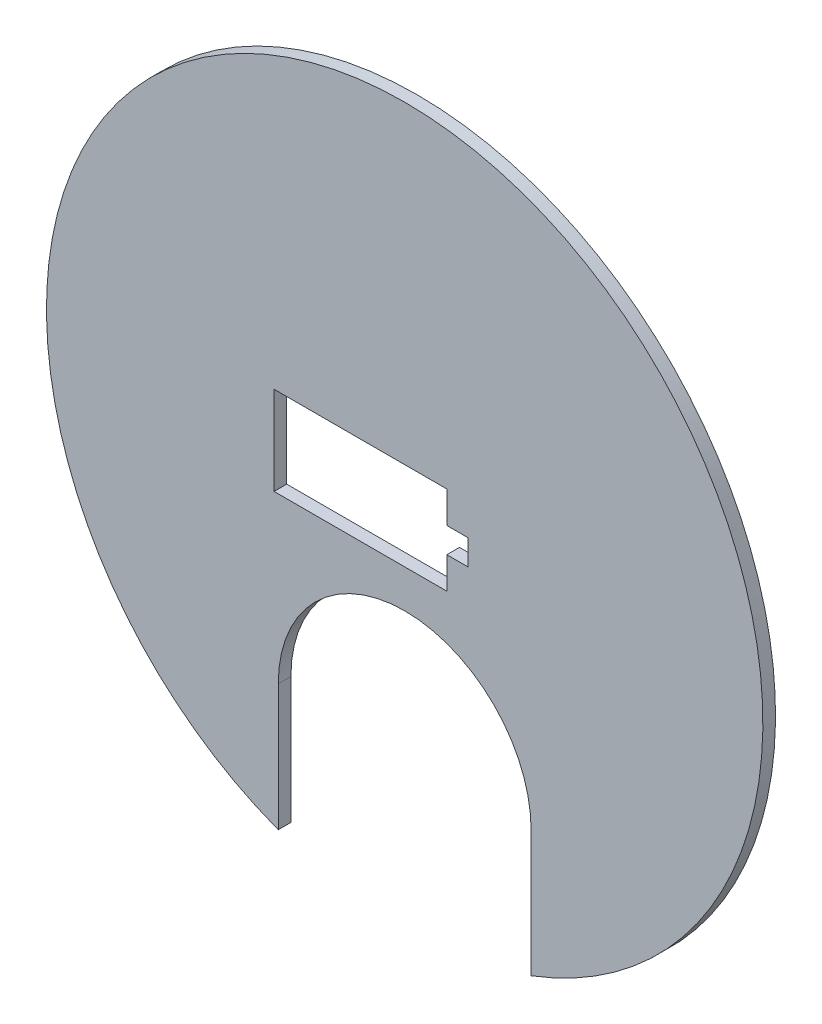
ISO-10303-21;
HEADER;
FILE_DESCRIPTION(('STEP AP214'),'2;1');
FILE_NAME('part.step','',(''),(''),'','','');
FILE_SCHEMA(('AUTOMOTIVE_DESIGN { 1 0 10303 214 1 1 1 1 }'));
ENDSEC;
DATA;
#1=APPLICATION_CONTEXT('core data for automotive mechanical design processes');
#2=APPLICATION_PROTOCOL_DEFINITION('international standard','automotive_design',2000,#1);
#3=PRODUCT_CONTEXT('',#1,'mechanical');
#4=PRODUCT('Part','Part','',(#3));
#5=PRODUCT_RELATED_PRODUCT_CATEGORY('part','',(#4));
#6=PRODUCT_DEFINITION_FORMATION('','',#4);
#7=PRODUCT_DEFINITION_CONTEXT('part definition',#1,'design');
#8=PRODUCT_DEFINITION('design','',#6,#7);
#9=PRODUCT_DEFINITION_SHAPE('','',#8);
#10=(LENGTH_UNIT() NAMED_UNIT(*) SI_UNIT(.MILLI.,.METRE.));
#11=(NAMED_UNIT(*) PLANE_ANGLE_UNIT() SI_UNIT($,.RADIAN.));
#12=(NAMED_UNIT(*) SI_UNIT($,.STERADIAN.) SOLID_ANGLE_UNIT());
#13=UNCERTAINTY_MEASURE_WITH_UNIT(LENGTH_MEASURE(1.E-05),#10,'distance_accuracy_value','');
#14=(GEOMETRIC_REPRESENTATION_CONTEXT(3) GLOBAL_UNCERTAINTY_ASSIGNED_CONTEXT((#13)) GLOBAL_UNIT_ASSIGNED_CONTEXT((#10,
#11,#12)) REPRESENTATION_CONTEXT('',''));
#15=CARTESIAN_POINT('',(0.,0.,0.));
#16=DIRECTION('',(0.,0.,1.));
#17=DIRECTION('',(1.,0.,0.));
#18=AXIS2_PLACEMENT_3D('',#15,#16,#17);
#19=CARTESIAN_POINT('',(-11.1979245368425,8.24446622018527,3.));
#20=DIRECTION('',(0.,0.,-1.));
#21=DIRECTION('',(-1.,0.,0.));
#22=AXIS2_PLACEMENT_3D('',#19,#20,#21);
#23=CYLINDRICAL_SURFACE('',#22,85.);
#24=CARTESIAN_POINT('',(-11.1979245368425,8.24446622018527,3.));
#25=DIRECTION('',(0.,0.,1.));
#26=DIRECTION('',(1.,0.,0.));
#27=AXIS2_PLACEMENT_3D('',#24,#25,#26);
#28=CIRCLE('',#27,85.);
#29=CARTESIAN_POINT('',(18.8020754631574,-71.2854023827491,3.));
#30=VERTEX_POINT('',#29);
#31=CARTESIAN_POINT('',(-41.1979245368426,-71.285402382749,3.));
#32=VERTEX_POINT('',#31);
#33=EDGE_CURVE('E11',#30,#32,#28,.T.);
#34=ORIENTED_EDGE('',*,*,#33,.F.);
#35=DIRECTION('',(0.,0.,-1.));
#36=VECTOR('',#35,1.);
#37=CARTESIAN_POINT('',(18.8020754631574,-71.2854023827491,3.));
#38=LINE('',#37,#36);
#39=CARTESIAN_POINT('',(18.8020754631574,-71.2854023827491,0.));
#40=VERTEX_POINT('',#39);
#41=EDGE_CURVE('E150',#30,#40,#38,.T.);
#42=ORIENTED_EDGE('',*,*,#41,.T.);
#43=CARTESIAN_POINT('',(-11.1979245368425,8.24446622018527,0.));
#44=DIRECTION('',(0.,0.,1.));
#45=DIRECTION('',(1.,0.,0.));
#46=AXIS2_PLACEMENT_3D('',#43,#44,#45);
#47=CIRCLE('',#46,85.);
#48=CARTESIAN_POINT('',(-41.1979245368426,-71.285402382749,0.));
#49=VERTEX_POINT('',#48);
#50=EDGE_CURVE('E36',#40,#49,#47,.T.);
#51=ORIENTED_EDGE('',*,*,#50,.T.);
#52=DIRECTION('',(0.,0.,-1.));
#53=VECTOR('',#52,1.);
#54=CARTESIAN_POINT('',(-41.1979245368426,-71.285402382749,3.));
#55=LINE('',#54,#53);
#56=EDGE_CURVE('E47',#32,#49,#55,.T.);
#57=ORIENTED_EDGE('',*,*,#56,.F.);
#58=EDGE_LOOP('',(#34,#42,#51,#57));
#59=FACE_BOUND('',#58,.T.);
#60=ADVANCED_FACE('F33',(#59),#23,.T.);
#61=CARTESIAN_POINT('',(-11.1979245368425,8.24446622018527,3.));
#62=DIRECTION('',(0.,0.,1.));
#63=DIRECTION('',(1.,0.,0.));
#64=AXIS2_PLACEMENT_3D('',#61,#62,#63);
#65=PLANE('',#64);
#66=DIRECTION('',(0.,-1.,0.));
#67=VECTOR('',#66,1.);
#68=CARTESIAN_POINT('',(18.8020754631574,-71.2854023827491,3.));
#69=LINE('',#68,#67);
#70=CARTESIAN_POINT('',(18.8020754631574,-41.2854023827491,3.));
#71=VERTEX_POINT('',#70);
#72=EDGE_CURVE('E134',#71,#30,#69,.T.);
#73=ORIENTED_EDGE('',*,*,#72,.T.);
#74=ORIENTED_EDGE('',*,*,#33,.T.);
#75=DIRECTION('',(0.,1.,0.));
#76=VECTOR('',#75,1.);
#77=CARTESIAN_POINT('',(-41.1979245368426,-41.285402382749,3.));
#78=LINE('',#77,#76);
#79=CARTESIAN_POINT('',(-41.1979245368426,-41.285402382749,3.));
#80=VERTEX_POINT('',#79);
#81=EDGE_CURVE('E120',#32,#80,#78,.T.);
#82=ORIENTED_EDGE('',*,*,#81,.T.);
#83=CARTESIAN_POINT('',(-11.1979245368426,-41.285402382749,3.));
#84=DIRECTION('',(0.,0.,-1.));
#85=DIRECTION('',(1.,0.,0.));
#86=AXIS2_PLACEMENT_3D('',#83,#84,#85);
#87=CIRCLE('',#86,30.);
#88=EDGE_CURVE('E126',#80,#71,#87,.T.);
#89=ORIENTED_EDGE('',*,*,#88,.T.);
#90=EDGE_LOOP('',(#73,#74,#82,#89));
#91=FACE_BOUND('',#90,.T.);
#92=DIRECTION('',(0.,-1.,0.));
#93=VECTOR('',#92,1.);
#94=CARTESIAN_POINT('',(3.80207546315745,0.,3.));
#95=LINE('',#94,#93);
#96=CARTESIAN_POINT('',(3.80207546315745,11.2444662201853,3.));
#97=VERTEX_POINT('',#96);
#98=CARTESIAN_POINT('',(3.80207546315745,5.24446622018527,3.));
#99=VERTEX_POINT('',#98);
#100=EDGE_CURVE('E156',#97,#99,#95,.T.);
#101=ORIENTED_EDGE('',*,*,#100,.T.);
#102=DIRECTION('',(-1.,0.,0.));
#103=VECTOR('',#102,1.);
#104=CARTESIAN_POINT('',(0.,5.24446622018527,3.));
#105=LINE('',#104,#103);
#106=CARTESIAN_POINT('',(-1.19792453684255,5.24446622018527,3.));
#107=VERTEX_POINT('',#106);
#108=EDGE_CURVE('E159',#99,#107,#105,.T.);
#109=ORIENTED_EDGE('',*,*,#108,.T.);
#110=DIRECTION('',(0.,-1.,0.));
#111=VECTOR('',#110,1.);
#112=CARTESIAN_POINT('',(-1.19792453684255,0.,3.));
#113=LINE('',#112,#111);
#114=CARTESIAN_POINT('',(-1.19792453684255,-2.25553377981473,3.));
#115=VERTEX_POINT('',#114);
#116=EDGE_CURVE('E55',#107,#115,#113,.T.);
#117=ORIENTED_EDGE('',*,*,#116,.T.);
#118=DIRECTION('',(-1.,0.,0.));
#119=VECTOR('',#118,1.);
#120=CARTESIAN_POINT('',(0.,-2.25553377981473,3.));
#121=LINE('',#120,#119);
#122=CARTESIAN_POINT('',(-42.1979245368425,-2.25553377981473,3.));
#123=VERTEX_POINT('',#122);
#124=EDGE_CURVE('E164',#115,#123,#121,.T.);
#125=ORIENTED_EDGE('',*,*,#124,.T.);
#126=DIRECTION('',(0.,-1.,0.));
#127=VECTOR('',#126,1.);
#128=CARTESIAN_POINT('',(-42.1979245368425,0.,3.));
#129=LINE('',#128,#127);
#130=CARTESIAN_POINT('',(-42.1979245368425,18.7444662201853,3.));
#131=VERTEX_POINT('',#130);
#132=EDGE_CURVE('E167',#131,#123,#129,.T.);
#133=ORIENTED_EDGE('',*,*,#132,.F.);
#134=DIRECTION('',(-1.,0.,0.));
#135=VECTOR('',#134,1.);
#136=CARTESIAN_POINT('',(0.,18.7444662201853,3.));
#137=LINE('',#136,#135);
#138=CARTESIAN_POINT('',(-1.19792453684255,18.7444662201853,3.));
#139=VERTEX_POINT('',#138);
#140=EDGE_CURVE('E169',#139,#131,#137,.T.);
#141=ORIENTED_EDGE('',*,*,#140,.F.);
#142=DIRECTION('',(0.,-1.,0.));
#143=VECTOR('',#142,1.);
#144=CARTESIAN_POINT('',(-1.19792453684255,0.,3.));
#145=LINE('',#144,#143);
#146=CARTESIAN_POINT('',(-1.19792453684255,11.2444662201853,3.));
#147=VERTEX_POINT('',#146);
#148=EDGE_CURVE('E171',#139,#147,#145,.T.);
#149=ORIENTED_EDGE('',*,*,#148,.T.);
#150=DIRECTION('',(-1.,0.,0.));
#151=VECTOR('',#150,1.);
#152=CARTESIAN_POINT('',(0.,11.2444662201853,3.));
#153=LINE('',#152,#151);
#154=EDGE_CURVE('E174',#97,#147,#153,.T.);
#155=ORIENTED_EDGE('',*,*,#154,.F.);
#156=EDGE_LOOP('',(#101,#109,#117,#125,#133,#141,#149,#155));
#157=FACE_BOUND('',#156,.T.);
#158=ADVANCED_FACE('F137',(#91,#157),#65,.T.);
#159=CARTESIAN_POINT('',(-11.1979245368425,8.24446622018527,0.));
#160=DIRECTION('',(0.,0.,1.));
#161=DIRECTION('',(1.,0.,0.));
#162=AXIS2_PLACEMENT_3D('',#159,#160,#161);
#163=PLANE('',#162);
#164=DIRECTION('',(-1.,0.,0.));
#165=VECTOR('',#164,1.);
#166=CARTESIAN_POINT('',(0.,5.24446622018527,0.));
#167=LINE('',#166,#165);
#168=CARTESIAN_POINT('',(3.80207546315745,5.24446622018527,0.));
#169=VERTEX_POINT('',#168);
#170=CARTESIAN_POINT('',(-1.19792453684255,5.24446622018527,0.));
#171=VERTEX_POINT('',#170);
#172=EDGE_CURVE('E178',#169,#171,#167,.T.);
#173=ORIENTED_EDGE('',*,*,#172,.F.);
#174=DIRECTION('',(0.,-1.,0.));
#175=VECTOR('',#174,1.);
#176=CARTESIAN_POINT('',(3.80207546315745,0.,0.));
#177=LINE('',#176,#175);
#178=CARTESIAN_POINT('',(3.80207546315745,11.2444662201853,0.));
#179=VERTEX_POINT('',#178);
#180=EDGE_CURVE('E152',#179,#169,#177,.T.);
#181=ORIENTED_EDGE('',*,*,#180,.F.);
#182=DIRECTION('',(-1.,0.,0.));
#183=VECTOR('',#182,1.);
#184=CARTESIAN_POINT('',(0.,11.2444662201853,0.));
#185=LINE('',#184,#183);
#186=CARTESIAN_POINT('',(-1.19792453684255,11.2444662201853,0.));
#187=VERTEX_POINT('',#186);
#188=EDGE_CURVE('E160',#179,#187,#185,.T.);
#189=ORIENTED_EDGE('',*,*,#188,.T.);
#190=DIRECTION('',(0.,-1.,0.));
#191=VECTOR('',#190,1.);
#192=CARTESIAN_POINT('',(-1.19792453684255,0.,0.));
#193=LINE('',#192,#191);
#194=CARTESIAN_POINT('',(-1.19792453684255,18.7444662201853,0.));
#195=VERTEX_POINT('',#194);
#196=EDGE_CURVE('E193',#195,#187,#193,.T.);
#197=ORIENTED_EDGE('',*,*,#196,.F.);
#198=DIRECTION('',(-1.,0.,0.));
#199=VECTOR('',#198,1.);
#200=CARTESIAN_POINT('',(0.,18.7444662201853,0.));
#201=LINE('',#200,#199);
#202=CARTESIAN_POINT('',(-42.1979245368425,18.7444662201853,0.));
#203=VERTEX_POINT('',#202);
#204=EDGE_CURVE('E190',#195,#203,#201,.T.);
#205=ORIENTED_EDGE('',*,*,#204,.T.);
#206=DIRECTION('',(0.,-1.,0.));
#207=VECTOR('',#206,1.);
#208=CARTESIAN_POINT('',(-42.1979245368425,0.,0.));
#209=LINE('',#208,#207);
#210=CARTESIAN_POINT('',(-42.1979245368425,-2.25553377981473,0.));
#211=VERTEX_POINT('',#210);
#212=EDGE_CURVE('E187',#203,#211,#209,.T.);
#213=ORIENTED_EDGE('',*,*,#212,.T.);
#214=DIRECTION('',(-1.,0.,0.));
#215=VECTOR('',#214,1.);
#216=CARTESIAN_POINT('',(0.,-2.25553377981473,0.));
#217=LINE('',#216,#215);
#218=CARTESIAN_POINT('',(-1.19792453684255,-2.25553377981473,0.));
#219=VERTEX_POINT('',#218);
#220=EDGE_CURVE('E184',#219,#211,#217,.T.);
#221=ORIENTED_EDGE('',*,*,#220,.F.);
#222=DIRECTION('',(0.,-1.,0.));
#223=VECTOR('',#222,1.);
#224=CARTESIAN_POINT('',(-1.19792453684255,0.,0.));
#225=LINE('',#224,#223);
#226=EDGE_CURVE('E181',#171,#219,#225,.T.);
#227=ORIENTED_EDGE('',*,*,#226,.F.);
#228=EDGE_LOOP('',(#173,#181,#189,#197,#205,#213,#221,#227));
#229=FACE_BOUND('',#228,.T.);
#230=ORIENTED_EDGE('',*,*,#50,.F.);
#231=DIRECTION('',(0.,-1.,0.));
#232=VECTOR('',#231,1.);
#233=CARTESIAN_POINT('',(18.8020754631574,-71.2854023827491,0.));
#234=LINE('',#233,#232);
#235=CARTESIAN_POINT('',(18.8020754631574,-41.2854023827491,0.));
#236=VERTEX_POINT('',#235);
#237=EDGE_CURVE('E127',#236,#40,#234,.T.);
#238=ORIENTED_EDGE('',*,*,#237,.F.);
#239=CARTESIAN_POINT('',(-11.1979245368426,-41.285402382749,0.));
#240=DIRECTION('',(0.,0.,-1.));
#241=DIRECTION('',(1.,0.,0.));
#242=AXIS2_PLACEMENT_3D('',#239,#240,#241);
#243=CIRCLE('',#242,30.);
#244=CARTESIAN_POINT('',(-41.1979245368426,-41.285402382749,0.));
#245=VERTEX_POINT('',#244);
#246=EDGE_CURVE('E146',#245,#236,#243,.T.);
#247=ORIENTED_EDGE('',*,*,#246,.F.);
#248=DIRECTION('',(0.,1.,0.));
#249=VECTOR('',#248,1.);
#250=CARTESIAN_POINT('',(-41.1979245368426,-41.285402382749,0.));
#251=LINE('',#250,#249);
#252=EDGE_CURVE('E144',#49,#245,#251,.T.);
#253=ORIENTED_EDGE('',*,*,#252,.F.);
#254=EDGE_LOOP('',(#230,#238,#247,#253));
#255=FACE_BOUND('',#254,.T.);
#256=ADVANCED_FACE('F222',(#229,#255),#163,.F.);
#257=CARTESIAN_POINT('',(3.80207546315745,0.,3.));
#258=DIRECTION('',(1.,0.,0.));
#259=DIRECTION('',(0.,1.,0.));
#260=AXIS2_PLACEMENT_3D('',#257,#258,#259);
#261=PLANE('',#260);
#262=ORIENTED_EDGE('',*,*,#180,.T.);
#263=DIRECTION('',(0.,0.,-1.));
#264=VECTOR('',#263,1.);
#265=CARTESIAN_POINT('',(3.80207546315745,5.24446622018527,3.));
#266=LINE('',#265,#264);
#267=EDGE_CURVE('E176',#99,#169,#266,.T.);
#268=ORIENTED_EDGE('',*,*,#267,.F.);
#269=ORIENTED_EDGE('',*,*,#100,.F.);
#270=DIRECTION('',(0.,0.,-1.));
#271=VECTOR('',#270,1.);
#272=CARTESIAN_POINT('',(3.80207546315745,11.2444662201853,3.));
#273=LINE('',#272,#271);
#274=EDGE_CURVE('E198',#97,#179,#273,.T.);
#275=ORIENTED_EDGE('',*,*,#274,.T.);
#276=EDGE_LOOP('',(#262,#268,#269,#275));
#277=FACE_BOUND('',#276,.T.);
#278=ADVANCED_FACE('F228',(#277),#261,.F.);
#279=CARTESIAN_POINT('',(0.,11.2444662201853,3.));
#280=DIRECTION('',(0.,-1.,0.));
#281=DIRECTION('',(0.,0.,-1.));
#282=AXIS2_PLACEMENT_3D('',#279,#280,#281);
#283=PLANE('',#282);
#284=ORIENTED_EDGE('',*,*,#188,.F.);
#285=ORIENTED_EDGE('',*,*,#274,.F.);
#286=ORIENTED_EDGE('',*,*,#154,.T.);
#287=DIRECTION('',(0.,0.,-1.));
#288=VECTOR('',#287,1.);
#289=CARTESIAN_POINT('',(-1.19792453684255,11.2444662201853,3.));
#290=LINE('',#289,#288);
#291=EDGE_CURVE('E200',#147,#187,#290,.T.);
#292=ORIENTED_EDGE('',*,*,#291,.T.);
#293=EDGE_LOOP('',(#284,#285,#286,#292));
#294=FACE_BOUND('',#293,.T.);
#295=ADVANCED_FACE('F231',(#294),#283,.T.);
#296=CARTESIAN_POINT('',(-1.19792453684255,0.,3.));
#297=DIRECTION('',(1.,0.,0.));
#298=DIRECTION('',(0.,1.,0.));
#299=AXIS2_PLACEMENT_3D('',#296,#297,#298);
#300=PLANE('',#299);
#301=ORIENTED_EDGE('',*,*,#196,.T.);
#302=ORIENTED_EDGE('',*,*,#291,.F.);
#303=ORIENTED_EDGE('',*,*,#148,.F.);
#304=DIRECTION('',(0.,0.,-1.));
#305=VECTOR('',#304,1.);
#306=CARTESIAN_POINT('',(-1.19792453684255,18.7444662201853,3.));
#307=LINE('',#306,#305);
#308=EDGE_CURVE('E202',#139,#195,#307,.T.);
#309=ORIENTED_EDGE('',*,*,#308,.T.);
#310=EDGE_LOOP('',(#301,#302,#303,#309));
#311=FACE_BOUND('',#310,.T.);
#312=ADVANCED_FACE('F236',(#311),#300,.F.);
#313=CARTESIAN_POINT('',(0.,18.7444662201853,3.));
#314=DIRECTION('',(0.,-1.,0.));
#315=DIRECTION('',(0.,0.,-1.));
#316=AXIS2_PLACEMENT_3D('',#313,#314,#315);
#317=PLANE('',#316);
#318=ORIENTED_EDGE('',*,*,#204,.F.);
#319=ORIENTED_EDGE('',*,*,#308,.F.);
#320=ORIENTED_EDGE('',*,*,#140,.T.);
#321=DIRECTION('',(0.,0.,-1.));
#322=VECTOR('',#321,1.);
#323=CARTESIAN_POINT('',(-42.1979245368425,18.7444662201853,3.));
#324=LINE('',#323,#322);
#325=EDGE_CURVE('E204',#131,#203,#324,.T.);
#326=ORIENTED_EDGE('',*,*,#325,.T.);
#327=EDGE_LOOP('',(#318,#319,#320,#326));
#328=FACE_BOUND('',#327,.T.);
#329=ADVANCED_FACE('F240',(#328),#317,.T.);
#330=CARTESIAN_POINT('',(-42.1979245368425,0.,3.));
#331=DIRECTION('',(1.,0.,0.));
#332=DIRECTION('',(0.,0.,-1.));
#333=AXIS2_PLACEMENT_3D('',#330,#331,#332);
#334=PLANE('',#333);
#335=ORIENTED_EDGE('',*,*,#212,.F.);
#336=ORIENTED_EDGE('',*,*,#325,.F.);
#337=ORIENTED_EDGE('',*,*,#132,.T.);
#338=DIRECTION('',(0.,0.,-1.));
#339=VECTOR('',#338,1.);
#340=CARTESIAN_POINT('',(-42.1979245368425,-2.25553377981473,3.));
#341=LINE('',#340,#339);
#342=EDGE_CURVE('E206',#123,#211,#341,.T.);
#343=ORIENTED_EDGE('',*,*,#342,.T.);
#344=EDGE_LOOP('',(#335,#336,#337,#343));
#345=FACE_BOUND('',#344,.T.);
#346=ADVANCED_FACE('F245',(#345),#334,.T.);
#347=CARTESIAN_POINT('',(0.,-2.25553377981473,3.));
#348=DIRECTION('',(0.,-1.,0.));
#349=DIRECTION('',(0.,0.,-1.));
#350=AXIS2_PLACEMENT_3D('',#347,#348,#349);
#351=PLANE('',#350);
#352=ORIENTED_EDGE('',*,*,#220,.T.);
#353=ORIENTED_EDGE('',*,*,#342,.F.);
#354=ORIENTED_EDGE('',*,*,#124,.F.);
#355=DIRECTION('',(0.,0.,-1.));
#356=VECTOR('',#355,1.);
#357=CARTESIAN_POINT('',(-1.19792453684255,-2.25553377981473,3.));
#358=LINE('',#357,#356);
#359=EDGE_CURVE('E208',#115,#219,#358,.T.);
#360=ORIENTED_EDGE('',*,*,#359,.T.);
#361=EDGE_LOOP('',(#352,#353,#354,#360));
#362=FACE_BOUND('',#361,.T.);
#363=ADVANCED_FACE('F248',(#362),#351,.F.);
#364=CARTESIAN_POINT('',(-1.19792453684255,0.,3.));
#365=DIRECTION('',(1.,0.,0.));
#366=DIRECTION('',(0.,1.,0.));
#367=AXIS2_PLACEMENT_3D('',#364,#365,#366);
#368=PLANE('',#367);
#369=ORIENTED_EDGE('',*,*,#226,.T.);
#370=ORIENTED_EDGE('',*,*,#359,.F.);
#371=ORIENTED_EDGE('',*,*,#116,.F.);
#372=DIRECTION('',(0.,0.,-1.));
#373=VECTOR('',#372,1.);
#374=CARTESIAN_POINT('',(-1.19792453684255,5.24446622018527,3.));
#375=LINE('',#374,#373);
#376=EDGE_CURVE('E210',#107,#171,#375,.T.);
#377=ORIENTED_EDGE('',*,*,#376,.T.);
#378=EDGE_LOOP('',(#369,#370,#371,#377));
#379=FACE_BOUND('',#378,.T.);
#380=ADVANCED_FACE('F225',(#379),#368,.F.);
#381=CARTESIAN_POINT('',(0.,5.24446622018527,3.));
#382=DIRECTION('',(0.,-1.,0.));
#383=DIRECTION('',(0.,0.,-1.));
#384=AXIS2_PLACEMENT_3D('',#381,#382,#383);
#385=PLANE('',#384);
#386=ORIENTED_EDGE('',*,*,#172,.T.);
#387=ORIENTED_EDGE('',*,*,#376,.F.);
#388=ORIENTED_EDGE('',*,*,#108,.F.);
#389=ORIENTED_EDGE('',*,*,#267,.T.);
#390=EDGE_LOOP('',(#386,#387,#388,#389));
#391=FACE_BOUND('',#390,.T.);
#392=ADVANCED_FACE('F216',(#391),#385,.F.);
#393=CARTESIAN_POINT('',(18.8020754631574,-71.2854023827491,3.));
#394=DIRECTION('',(1.,0.,0.));
#395=DIRECTION('',(0.,0.,-1.));
#396=AXIS2_PLACEMENT_3D('',#393,#394,#395);
#397=PLANE('',#396);
#398=ORIENTED_EDGE('',*,*,#237,.T.);
#399=ORIENTED_EDGE('',*,*,#41,.F.);
#400=ORIENTED_EDGE('',*,*,#72,.F.);
#401=DIRECTION('',(0.,0.,-1.));
#402=VECTOR('',#401,1.);
#403=CARTESIAN_POINT('',(18.8020754631574,-41.2854023827491,3.));
#404=LINE('',#403,#402);
#405=EDGE_CURVE('E153',#71,#236,#404,.T.);
#406=ORIENTED_EDGE('',*,*,#405,.T.);
#407=EDGE_LOOP('',(#398,#399,#400,#406));
#408=FACE_BOUND('',#407,.T.);
#409=ADVANCED_FACE('F269',(#408),#397,.F.);
#410=CARTESIAN_POINT('',(-11.1979245368426,-41.285402382749,3.));
#411=DIRECTION('',(0.,0.,-1.));
#412=DIRECTION('',(-1.,0.,0.));
#413=AXIS2_PLACEMENT_3D('',#410,#411,#412);
#414=CYLINDRICAL_SURFACE('',#413,30.);
#415=ORIENTED_EDGE('',*,*,#246,.T.);
#416=ORIENTED_EDGE('',*,*,#405,.F.);
#417=ORIENTED_EDGE('',*,*,#88,.F.);
#418=DIRECTION('',(0.,0.,-1.));
#419=VECTOR('',#418,1.);
#420=CARTESIAN_POINT('',(-41.1979245368426,-41.285402382749,3.));
#421=LINE('',#420,#419);
#422=EDGE_CURVE('E122',#80,#245,#421,.T.);
#423=ORIENTED_EDGE('',*,*,#422,.T.);
#424=EDGE_LOOP('',(#415,#416,#417,#423));
#425=FACE_BOUND('',#424,.T.);
#426=ADVANCED_FACE('F273',(#425),#414,.F.);
#427=CARTESIAN_POINT('',(-41.1979245368426,-41.285402382749,3.));
#428=DIRECTION('',(-1.,0.,0.));
#429=DIRECTION('',(0.,-1.,0.));
#430=AXIS2_PLACEMENT_3D('',#427,#428,#429);
#431=PLANE('',#430);
#432=ORIENTED_EDGE('',*,*,#252,.T.);
#433=ORIENTED_EDGE('',*,*,#422,.F.);
#434=ORIENTED_EDGE('',*,*,#81,.F.);
#435=ORIENTED_EDGE('',*,*,#56,.T.);
#436=EDGE_LOOP('',(#432,#433,#434,#435));
#437=FACE_BOUND('',#436,.T.);
#438=ADVANCED_FACE('F121',(#437),#431,.F.);
#439=CLOSED_SHELL('',(#60,#158,#256,#278,#295,#312,#329,#346,#363,#380,#392,#409,#426,#438));
#440=MANIFOLD_SOLID_BREP('B2',#439);
#441=ADVANCED_BREP_SHAPE_REPRESENTATION('',(#18,#440),#14);
#442=SHAPE_DEFINITION_REPRESENTATION(#9,#441);
ENDSEC;
END-ISO-10303-21;
